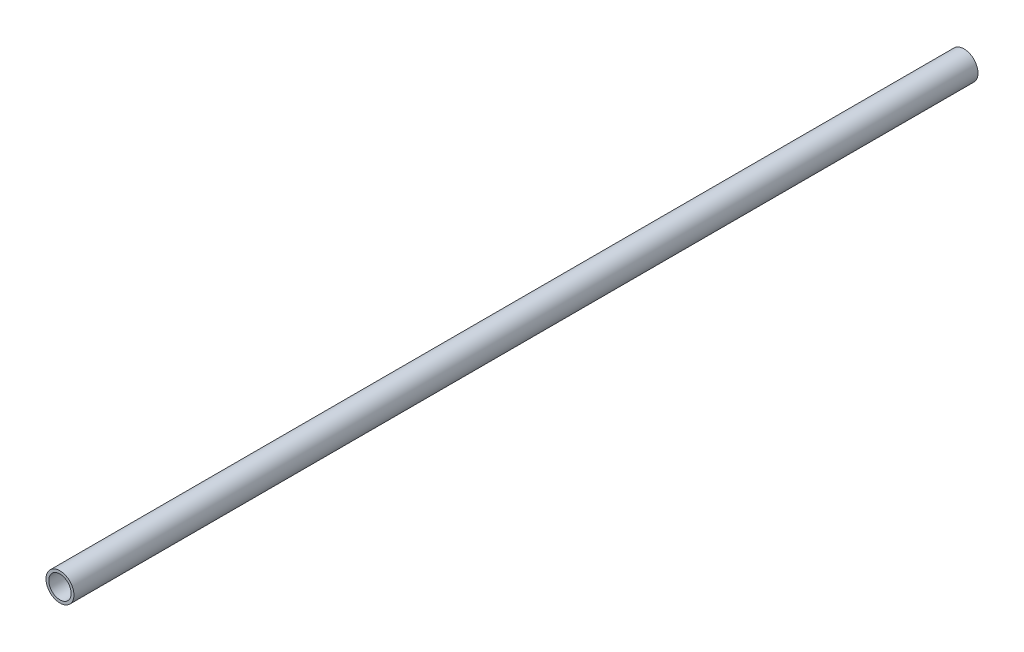
ISO-10303-21;
HEADER;
FILE_DESCRIPTION(('STEP AP214'),'2;1');
FILE_NAME('part.step','',(''),(''),'','','');
FILE_SCHEMA(('AUTOMOTIVE_DESIGN { 1 0 10303 214 1 1 1 1 }'));
ENDSEC;
DATA;
#1=APPLICATION_CONTEXT('core data for automotive mechanical design processes');
#2=APPLICATION_PROTOCOL_DEFINITION('international standard','automotive_design',2000,#1);
#3=PRODUCT_CONTEXT('',#1,'mechanical');
#4=PRODUCT('Part','Part','',(#3));
#5=PRODUCT_RELATED_PRODUCT_CATEGORY('part','',(#4));
#6=PRODUCT_DEFINITION_FORMATION('','',#4);
#7=PRODUCT_DEFINITION_CONTEXT('part definition',#1,'design');
#8=PRODUCT_DEFINITION('design','',#6,#7);
#9=PRODUCT_DEFINITION_SHAPE('','',#8);
#10=(LENGTH_UNIT() NAMED_UNIT(*) SI_UNIT(.MILLI.,.METRE.));
#11=(NAMED_UNIT(*) PLANE_ANGLE_UNIT() SI_UNIT($,.RADIAN.));
#12=(NAMED_UNIT(*) SI_UNIT($,.STERADIAN.) SOLID_ANGLE_UNIT());
#13=UNCERTAINTY_MEASURE_WITH_UNIT(LENGTH_MEASURE(1.E-05),#10,'distance_accuracy_value','');
#14=(GEOMETRIC_REPRESENTATION_CONTEXT(3) GLOBAL_UNCERTAINTY_ASSIGNED_CONTEXT((#13)) GLOBAL_UNIT_ASSIGNED_CONTEXT((#10,
#11,#12)) REPRESENTATION_CONTEXT('',''));
#15=CARTESIAN_POINT('',(0.,0.,0.));
#16=DIRECTION('',(0.,0.,1.));
#17=DIRECTION('',(1.,0.,0.));
#18=AXIS2_PLACEMENT_3D('',#15,#16,#17);
#19=CARTESIAN_POINT('',(0.,0.,161.5));
#20=DIRECTION('',(0.,0.,-1.));
#21=DIRECTION('',(-1.,0.,0.));
#22=AXIS2_PLACEMENT_3D('',#19,#20,#21);
#23=CYLINDRICAL_SURFACE('',#22,2.5);
#24=CARTESIAN_POINT('',(0.,0.,161.5));
#25=DIRECTION('',(0.,0.,1.));
#26=DIRECTION('',(1.,0.,0.));
#27=AXIS2_PLACEMENT_3D('',#24,#25,#26);
#28=CIRCLE('',#27,2.5);
#29=CARTESIAN_POINT('',(2.5,0.,161.5));
#30=VERTEX_POINT('',#29);
#31=EDGE_CURVE('E10',#30,#30,#28,.T.);
#32=ORIENTED_EDGE('',*,*,#31,.F.);
#33=EDGE_LOOP('',(#32));
#34=FACE_BOUND('',#33,.T.);
#35=CARTESIAN_POINT('',(0.,0.,0.));
#36=DIRECTION('',(0.,0.,1.));
#37=DIRECTION('',(1.,0.,0.));
#38=AXIS2_PLACEMENT_3D('',#35,#36,#37);
#39=CIRCLE('',#38,2.5);
#40=CARTESIAN_POINT('',(2.5,0.,0.));
#41=VERTEX_POINT('',#40);
#42=EDGE_CURVE('E39',#41,#41,#39,.T.);
#43=ORIENTED_EDGE('',*,*,#42,.T.);
#44=EDGE_LOOP('',(#43));
#45=FACE_BOUND('',#44,.T.);
#46=ADVANCED_FACE('F32',(#34,#45),#23,.T.);
#47=CARTESIAN_POINT('',(0.,0.,161.5));
#48=DIRECTION('',(0.,0.,1.));
#49=DIRECTION('',(1.,0.,0.));
#50=AXIS2_PLACEMENT_3D('',#47,#48,#49);
#51=PLANE('',#50);
#52=CARTESIAN_POINT('',(0.,0.,161.5));
#53=DIRECTION('',(0.,0.,1.));
#54=DIRECTION('',(1.,0.,0.));
#55=AXIS2_PLACEMENT_3D('',#52,#53,#54);
#56=CIRCLE('',#55,2.);
#57=CARTESIAN_POINT('',(2.,0.,161.5));
#58=VERTEX_POINT('',#57);
#59=EDGE_CURVE('E45',#58,#58,#56,.T.);
#60=ORIENTED_EDGE('',*,*,#59,.F.);
#61=EDGE_LOOP('',(#60));
#62=FACE_BOUND('',#61,.T.);
#63=ORIENTED_EDGE('',*,*,#31,.T.);
#64=EDGE_LOOP('',(#63));
#65=FACE_BOUND('',#64,.T.);
#66=ADVANCED_FACE('F61',(#62,#65),#51,.T.);
#67=CARTESIAN_POINT('',(0.,0.,0.));
#68=DIRECTION('',(0.,0.,1.));
#69=DIRECTION('',(1.,0.,0.));
#70=AXIS2_PLACEMENT_3D('',#67,#68,#69);
#71=PLANE('',#70);
#72=CARTESIAN_POINT('',(0.,0.,0.));
#73=DIRECTION('',(0.,0.,1.));
#74=DIRECTION('',(1.,0.,0.));
#75=AXIS2_PLACEMENT_3D('',#72,#73,#74);
#76=CIRCLE('',#75,2.);
#77=CARTESIAN_POINT('',(2.,0.,0.));
#78=VERTEX_POINT('',#77);
#79=EDGE_CURVE('E35',#78,#78,#76,.T.);
#80=ORIENTED_EDGE('',*,*,#79,.T.);
#81=EDGE_LOOP('',(#80));
#82=FACE_BOUND('',#81,.T.);
#83=ORIENTED_EDGE('',*,*,#42,.F.);
#84=EDGE_LOOP('',(#83));
#85=FACE_BOUND('',#84,.T.);
#86=ADVANCED_FACE('F52',(#82,#85),#71,.F.);
#87=CARTESIAN_POINT('',(0.,0.,-38.5));
#88=DIRECTION('',(0.,0.,1.));
#89=DIRECTION('',(1.,0.,0.));
#90=AXIS2_PLACEMENT_3D('',#87,#88,#89);
#91=CYLINDRICAL_SURFACE('',#90,2.);
#92=ORIENTED_EDGE('',*,*,#59,.T.);
#93=EDGE_LOOP('',(#92));
#94=FACE_BOUND('',#93,.T.);
#95=ORIENTED_EDGE('',*,*,#79,.F.);
#96=EDGE_LOOP('',(#95));
#97=FACE_BOUND('',#96,.T.);
#98=ADVANCED_FACE('F55',(#94,#97),#91,.F.);
#99=CLOSED_SHELL('',(#46,#66,#86,#98));
#100=MANIFOLD_SOLID_BREP('B2',#99);
#101=ADVANCED_BREP_SHAPE_REPRESENTATION('',(#18,#100),#14);
#102=SHAPE_DEFINITION_REPRESENTATION(#9,#101);
ENDSEC;
END-ISO-10303-21;
